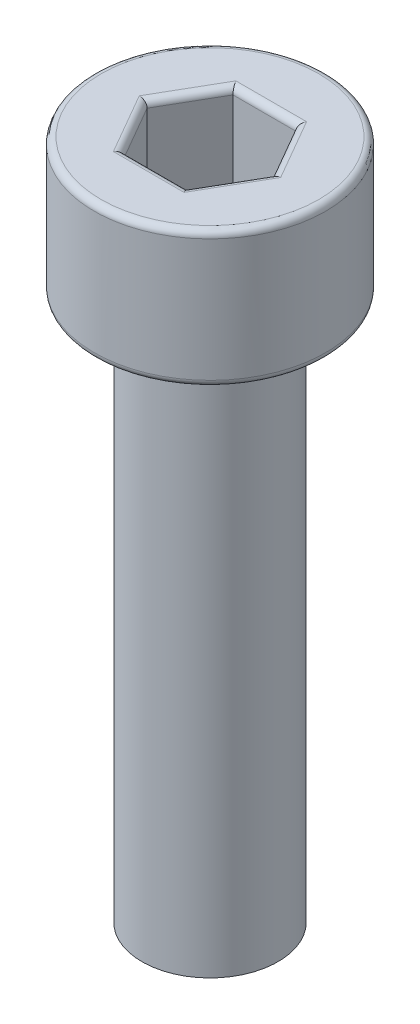
ISO-10303-21;
HEADER;
FILE_DESCRIPTION(('STEP AP214'),'2;1');
FILE_NAME('part.step','',(''),(''),'','','');
FILE_SCHEMA(('AUTOMOTIVE_DESIGN { 1 0 10303 214 1 1 1 1 }'));
ENDSEC;
DATA;
#1=APPLICATION_CONTEXT('core data for automotive mechanical design processes');
#2=APPLICATION_PROTOCOL_DEFINITION('international standard','automotive_design',2000,#1);
#3=PRODUCT_CONTEXT('',#1,'mechanical');
#4=PRODUCT('Part','Part','',(#3));
#5=PRODUCT_RELATED_PRODUCT_CATEGORY('part','',(#4));
#6=PRODUCT_DEFINITION_FORMATION('','',#4);
#7=PRODUCT_DEFINITION_CONTEXT('part definition',#1,'design');
#8=PRODUCT_DEFINITION('design','',#6,#7);
#9=PRODUCT_DEFINITION_SHAPE('','',#8);
#10=(LENGTH_UNIT() NAMED_UNIT(*) SI_UNIT(.MILLI.,.METRE.));
#11=(NAMED_UNIT(*) PLANE_ANGLE_UNIT() SI_UNIT($,.RADIAN.));
#12=(NAMED_UNIT(*) SI_UNIT($,.STERADIAN.) SOLID_ANGLE_UNIT());
#13=UNCERTAINTY_MEASURE_WITH_UNIT(LENGTH_MEASURE(1.E-05),#10,'distance_accuracy_value','');
#14=(GEOMETRIC_REPRESENTATION_CONTEXT(3) GLOBAL_UNCERTAINTY_ASSIGNED_CONTEXT((#13)) GLOBAL_UNIT_ASSIGNED_CONTEXT((#10,
#11,#12)) REPRESENTATION_CONTEXT('',''));
#15=CARTESIAN_POINT('',(0.,0.,0.));
#16=DIRECTION('',(0.,0.,1.));
#17=DIRECTION('',(1.,0.,0.));
#18=AXIS2_PLACEMENT_3D('',#15,#16,#17);
#19=CARTESIAN_POINT('',(2.45056654618361E-11,5.,0.));
#20=DIRECTION('',(0.,-1.,0.));
#21=DIRECTION('',(1.,0.,0.));
#22=AXIS2_PLACEMENT_3D('',#19,#20,#21);
#23=PLANE('',#22);
#24=CARTESIAN_POINT('',(0.,5.,0.));
#25=DIRECTION('',(0.,-1.,0.));
#26=DIRECTION('',(1.,0.,0.));
#27=AXIS2_PLACEMENT_3D('',#24,#25,#26);
#28=CIRCLE('',#27,4.0000000000245);
#29=CARTESIAN_POINT('',(4.0000000000245,5.,0.));
#30=VERTEX_POINT('',#29);
#31=EDGE_CURVE('E179',#30,#30,#28,.F.);
#32=ORIENTED_EDGE('',*,*,#31,.T.);
#33=EDGE_LOOP('',(#32));
#34=FACE_BOUND('',#33,.T.);
#35=DIRECTION('',(-0.5,0.,0.866025403784439));
#36=VECTOR('',#35,1.);
#37=CARTESIAN_POINT('',(-1.94855715850886,5.,-1.12500000001061));
#38=LINE('',#37,#36);
#39=CARTESIAN_POINT('',(-2.59807621135332,5.,0.));
#40=VERTEX_POINT('',#39);
#41=CARTESIAN_POINT('',(-1.29903810567666,5.,-2.25));
#42=VERTEX_POINT('',#41);
#43=EDGE_CURVE('E174',#40,#42,#38,.F.);
#44=ORIENTED_EDGE('',*,*,#43,.T.);
#45=DIRECTION('',(-1.,0.,0.));
#46=VECTOR('',#45,1.);
#47=CARTESIAN_POINT('',(2.45056654618361E-11,5.,-2.25));
#48=LINE('',#47,#46);
#49=CARTESIAN_POINT('',(1.29903810567666,5.,-2.25));
#50=VERTEX_POINT('',#49);
#51=EDGE_CURVE('E176',#42,#50,#48,.F.);
#52=ORIENTED_EDGE('',*,*,#51,.T.);
#53=DIRECTION('',(-0.5,0.,-0.866025403784439));
#54=VECTOR('',#53,1.);
#55=CARTESIAN_POINT('',(1.94855715852111,5.,-1.12499999998939));
#56=LINE('',#55,#54);
#57=CARTESIAN_POINT('',(2.59807621135331,5.,0.));
#58=VERTEX_POINT('',#57);
#59=EDGE_CURVE('E166',#50,#58,#56,.F.);
#60=ORIENTED_EDGE('',*,*,#59,.T.);
#61=DIRECTION('',(0.5,0.,-0.866025403784439));
#62=VECTOR('',#61,1.);
#63=CARTESIAN_POINT('',(1.94855715852111,5.,1.12499999998939));
#64=LINE('',#63,#62);
#65=CARTESIAN_POINT('',(1.29903810567666,5.,2.25));
#66=VERTEX_POINT('',#65);
#67=EDGE_CURVE('E168',#58,#66,#64,.F.);
#68=ORIENTED_EDGE('',*,*,#67,.T.);
#69=DIRECTION('',(1.,0.,0.));
#70=VECTOR('',#69,1.);
#71=CARTESIAN_POINT('',(2.45052429358553E-11,5.,2.25));
#72=LINE('',#71,#70);
#73=CARTESIAN_POINT('',(-1.29903810567666,5.,2.25));
#74=VERTEX_POINT('',#73);
#75=EDGE_CURVE('E170',#66,#74,#72,.F.);
#76=ORIENTED_EDGE('',*,*,#75,.T.);
#77=DIRECTION('',(0.5,0.,0.866025403784439));
#78=VECTOR('',#77,1.);
#79=CARTESIAN_POINT('',(-1.94855715850886,5.,1.12500000001061));
#80=LINE('',#79,#78);
#81=EDGE_CURVE('E172',#74,#40,#80,.F.);
#82=ORIENTED_EDGE('',*,*,#81,.T.);
#83=EDGE_LOOP('',(#44,#52,#60,#68,#76,#82));
#84=FACE_BOUND('',#83,.T.);
#85=ADVANCED_FACE('F33',(#34,#84),#23,.F.);
#86=CARTESIAN_POINT('',(0.,21.3223243250921,0.));
#87=DIRECTION('',(0.,1.,0.));
#88=DIRECTION('',(-1.,0.,0.));
#89=AXIS2_PLACEMENT_3D('',#86,#87,#88);
#90=CYLINDRICAL_SURFACE('',#89,4.2500000000245);
#91=CARTESIAN_POINT('',(0.,0.25,0.));
#92=DIRECTION('',(0.,1.,0.));
#93=DIRECTION('',(-1.,0.,0.));
#94=AXIS2_PLACEMENT_3D('',#91,#92,#93);
#95=CIRCLE('',#94,4.2500000000245);
#96=CARTESIAN_POINT('',(-4.2500000000245,0.25,0.));
#97=VERTEX_POINT('',#96);
#98=EDGE_CURVE('E163',#97,#97,#95,.T.);
#99=ORIENTED_EDGE('',*,*,#98,.T.);
#100=EDGE_LOOP('',(#99));
#101=FACE_BOUND('',#100,.T.);
#102=CARTESIAN_POINT('',(0.,4.75,0.));
#103=DIRECTION('',(0.,-1.,0.));
#104=DIRECTION('',(1.,0.,0.));
#105=AXIS2_PLACEMENT_3D('',#102,#103,#104);
#106=CIRCLE('',#105,4.2500000000245);
#107=CARTESIAN_POINT('',(4.2500000000245,4.75,0.));
#108=VERTEX_POINT('',#107);
#109=EDGE_CURVE('E160',#108,#108,#106,.T.);
#110=ORIENTED_EDGE('',*,*,#109,.T.);
#111=EDGE_LOOP('',(#110));
#112=FACE_BOUND('',#111,.T.);
#113=ADVANCED_FACE('F240',(#101,#112),#90,.T.);
#114=CARTESIAN_POINT('',(4.2500000000245,0.,0.));
#115=DIRECTION('',(0.,1.,0.));
#116=DIRECTION('',(-1.,0.,0.));
#117=AXIS2_PLACEMENT_3D('',#114,#115,#116);
#118=PLANE('',#117);
#119=CARTESIAN_POINT('',(0.,0.,0.));
#120=DIRECTION('',(0.,1.,0.));
#121=DIRECTION('',(-1.,0.,0.));
#122=AXIS2_PLACEMENT_3D('',#119,#120,#121);
#123=CIRCLE('',#122,2.74999999997329);
#124=CARTESIAN_POINT('',(-2.74999999997329,0.,0.));
#125=VERTEX_POINT('',#124);
#126=EDGE_CURVE('E154',#125,#125,#123,.T.);
#127=ORIENTED_EDGE('',*,*,#126,.T.);
#128=EDGE_LOOP('',(#127));
#129=FACE_BOUND('',#128,.T.);
#130=CARTESIAN_POINT('',(0.,0.,0.));
#131=DIRECTION('',(0.,1.,0.));
#132=DIRECTION('',(-1.,0.,0.));
#133=AXIS2_PLACEMENT_3D('',#130,#131,#132);
#134=CIRCLE('',#133,4.0000000000245);
#135=CARTESIAN_POINT('',(-4.0000000000245,0.,0.));
#136=VERTEX_POINT('',#135);
#137=EDGE_CURVE('E151',#136,#136,#134,.F.);
#138=ORIENTED_EDGE('',*,*,#137,.T.);
#139=EDGE_LOOP('',(#138));
#140=FACE_BOUND('',#139,.T.);
#141=ADVANCED_FACE('F246',(#129,#140),#118,.F.);
#142=CARTESIAN_POINT('',(0.,21.3223243250921,0.));
#143=DIRECTION('',(0.,1.,0.));
#144=DIRECTION('',(-1.,0.,0.));
#145=AXIS2_PLACEMENT_3D('',#142,#143,#144);
#146=CYLINDRICAL_SURFACE('',#145,2.49999999997329);
#147=CARTESIAN_POINT('',(0.,-0.25,0.));
#148=DIRECTION('',(0.,1.,0.));
#149=DIRECTION('',(-1.,0.,0.));
#150=AXIS2_PLACEMENT_3D('',#147,#148,#149);
#151=CIRCLE('',#150,2.49999999997329);
#152=CARTESIAN_POINT('',(-2.49999999997329,-0.250000000000001,0.));
#153=VERTEX_POINT('',#152);
#154=EDGE_CURVE('E157',#153,#153,#151,.F.);
#155=ORIENTED_EDGE('',*,*,#154,.T.);
#156=EDGE_LOOP('',(#155));
#157=FACE_BOUND('',#156,.T.);
#158=CARTESIAN_POINT('',(0.,-20.,0.));
#159=DIRECTION('',(0.,1.,0.));
#160=DIRECTION('',(-1.,0.,0.));
#161=AXIS2_PLACEMENT_3D('',#158,#159,#160);
#162=CIRCLE('',#161,2.49999999997329);
#163=CARTESIAN_POINT('',(-2.49999999997329,-20.,0.));
#164=VERTEX_POINT('',#163);
#165=EDGE_CURVE('E139',#164,#164,#162,.T.);
#166=ORIENTED_EDGE('',*,*,#165,.T.);
#167=EDGE_LOOP('',(#166));
#168=FACE_BOUND('',#167,.T.);
#169=ADVANCED_FACE('F338',(#157,#168),#146,.T.);
#170=CARTESIAN_POINT('',(2.4999999999733,-20.,0.));
#171=DIRECTION('',(0.,1.,0.));
#172=DIRECTION('',(-1.,0.,0.));
#173=AXIS2_PLACEMENT_3D('',#170,#171,#172);
#174=PLANE('',#173);
#175=ORIENTED_EDGE('',*,*,#165,.F.);
#176=EDGE_LOOP('',(#175));
#177=FACE_BOUND('',#176,.T.);
#178=ADVANCED_FACE('F236',(#177),#174,.F.);
#179=CARTESIAN_POINT('',(1.15470053837925,1.5,2.));
#180=DIRECTION('',(0.866025403784439,0.,0.5));
#181=DIRECTION('',(0.5,0.,-0.866025403784439));
#182=AXIS2_PLACEMENT_3D('',#179,#180,#181);
#183=PLANE('',#182);
#184=DIRECTION('',(0.,1.,0.));
#185=VECTOR('',#184,1.);
#186=CARTESIAN_POINT('',(1.15470053837925,1.5,2.));
#187=LINE('',#186,#185);
#188=CARTESIAN_POINT('',(1.15470053837925,1.5,2.));
#189=VERTEX_POINT('',#188);
#190=CARTESIAN_POINT('',(1.15470053837925,4.75,2.));
#191=VERTEX_POINT('',#190);
#192=EDGE_CURVE('E137',#189,#191,#187,.T.);
#193=ORIENTED_EDGE('',*,*,#192,.T.);
#194=DIRECTION('',(0.5,0.,-0.866025403784439));
#195=VECTOR('',#194,1.);
#196=CARTESIAN_POINT('',(1.15470053837925,4.75,2.));
#197=LINE('',#196,#195);
#198=CARTESIAN_POINT('',(2.3094010767585,4.75,0.));
#199=VERTEX_POINT('',#198);
#200=EDGE_CURVE('E42',#191,#199,#197,.T.);
#201=ORIENTED_EDGE('',*,*,#200,.T.);
#202=DIRECTION('',(0.,1.,0.));
#203=VECTOR('',#202,1.);
#204=CARTESIAN_POINT('',(2.3094010767585,1.5,0.));
#205=LINE('',#204,#203);
#206=CARTESIAN_POINT('',(2.3094010767585,1.5,0.));
#207=VERTEX_POINT('',#206);
#208=EDGE_CURVE('E103',#207,#199,#205,.T.);
#209=ORIENTED_EDGE('',*,*,#208,.F.);
#210=DIRECTION('',(0.5,0.,-0.866025403784439));
#211=VECTOR('',#210,1.);
#212=CARTESIAN_POINT('',(1.15470053837925,1.5,2.));
#213=LINE('',#212,#211);
#214=EDGE_CURVE('E107',#189,#207,#213,.T.);
#215=ORIENTED_EDGE('',*,*,#214,.F.);
#216=EDGE_LOOP('',(#193,#201,#209,#215));
#217=FACE_BOUND('',#216,.T.);
#218=ADVANCED_FACE('F105',(#217),#183,.F.);
#219=CARTESIAN_POINT('',(-1.15470053837925,1.5,2.));
#220=DIRECTION('',(0.,0.,1.));
#221=DIRECTION('',(1.,0.,0.));
#222=AXIS2_PLACEMENT_3D('',#219,#220,#221);
#223=PLANE('',#222);
#224=DIRECTION('',(0.,1.,0.));
#225=VECTOR('',#224,1.);
#226=CARTESIAN_POINT('',(-1.15470053837925,1.5,2.));
#227=LINE('',#226,#225);
#228=CARTESIAN_POINT('',(-1.15470053837925,1.5,2.));
#229=VERTEX_POINT('',#228);
#230=CARTESIAN_POINT('',(-1.15470053837925,4.75,2.));
#231=VERTEX_POINT('',#230);
#232=EDGE_CURVE('E140',#229,#231,#227,.T.);
#233=ORIENTED_EDGE('',*,*,#232,.T.);
#234=DIRECTION('',(1.,0.,0.));
#235=VECTOR('',#234,1.);
#236=CARTESIAN_POINT('',(-1.15470053837925,4.75,2.));
#237=LINE('',#236,#235);
#238=EDGE_CURVE('E57',#231,#191,#237,.T.);
#239=ORIENTED_EDGE('',*,*,#238,.T.);
#240=ORIENTED_EDGE('',*,*,#192,.F.);
#241=DIRECTION('',(1.,0.,0.));
#242=VECTOR('',#241,1.);
#243=CARTESIAN_POINT('',(-1.15470053837925,1.5,2.));
#244=LINE('',#243,#242);
#245=EDGE_CURVE('E112',#229,#189,#244,.T.);
#246=ORIENTED_EDGE('',*,*,#245,.F.);
#247=EDGE_LOOP('',(#233,#239,#240,#246));
#248=FACE_BOUND('',#247,.T.);
#249=ADVANCED_FACE('F228',(#248),#223,.F.);
#250=CARTESIAN_POINT('',(-2.30940107675851,1.5,0.));
#251=DIRECTION('',(-0.866025403784438,0.,0.5));
#252=DIRECTION('',(0.5,0.,0.866025403784439));
#253=AXIS2_PLACEMENT_3D('',#250,#251,#252);
#254=PLANE('',#253);
#255=DIRECTION('',(0.,1.,0.));
#256=VECTOR('',#255,1.);
#257=CARTESIAN_POINT('',(-2.30940107675851,1.5,0.));
#258=LINE('',#257,#256);
#259=CARTESIAN_POINT('',(-2.30940107675851,1.5,0.));
#260=VERTEX_POINT('',#259);
#261=CARTESIAN_POINT('',(-2.30940107675851,4.75,0.));
#262=VERTEX_POINT('',#261);
#263=EDGE_CURVE('E142',#260,#262,#258,.T.);
#264=ORIENTED_EDGE('',*,*,#263,.T.);
#265=DIRECTION('',(0.5,0.,0.866025403784439));
#266=VECTOR('',#265,1.);
#267=CARTESIAN_POINT('',(-2.30940107675851,4.75,0.));
#268=LINE('',#267,#266);
#269=EDGE_CURVE('E187',#262,#231,#268,.T.);
#270=ORIENTED_EDGE('',*,*,#269,.T.);
#271=ORIENTED_EDGE('',*,*,#232,.F.);
#272=DIRECTION('',(0.5,0.,0.866025403784438));
#273=VECTOR('',#272,1.);
#274=CARTESIAN_POINT('',(-2.30940107675851,1.5,0.));
#275=LINE('',#274,#273);
#276=EDGE_CURVE('E134',#260,#229,#275,.T.);
#277=ORIENTED_EDGE('',*,*,#276,.F.);
#278=EDGE_LOOP('',(#264,#270,#271,#277));
#279=FACE_BOUND('',#278,.T.);
#280=ADVANCED_FACE('F227',(#279),#254,.F.);
#281=CARTESIAN_POINT('',(-1.15470053837925,1.5,-2.));
#282=DIRECTION('',(-0.866025403784438,0.,-0.5));
#283=DIRECTION('',(-0.5,0.,0.866025403784439));
#284=AXIS2_PLACEMENT_3D('',#281,#282,#283);
#285=PLANE('',#284);
#286=DIRECTION('',(0.,1.,0.));
#287=VECTOR('',#286,1.);
#288=CARTESIAN_POINT('',(-1.15470053837925,1.5,-2.));
#289=LINE('',#288,#287);
#290=CARTESIAN_POINT('',(-1.15470053837925,1.5,-2.));
#291=VERTEX_POINT('',#290);
#292=CARTESIAN_POINT('',(-1.15470053837925,4.75,-2.));
#293=VERTEX_POINT('',#292);
#294=EDGE_CURVE('E145',#291,#293,#289,.T.);
#295=ORIENTED_EDGE('',*,*,#294,.T.);
#296=DIRECTION('',(-0.5,0.,0.866025403784439));
#297=VECTOR('',#296,1.);
#298=CARTESIAN_POINT('',(-1.15470053837925,4.75,-2.));
#299=LINE('',#298,#297);
#300=EDGE_CURVE('E185',#293,#262,#299,.T.);
#301=ORIENTED_EDGE('',*,*,#300,.T.);
#302=ORIENTED_EDGE('',*,*,#263,.F.);
#303=DIRECTION('',(-0.5,0.,0.866025403784439));
#304=VECTOR('',#303,1.);
#305=CARTESIAN_POINT('',(-1.15470053837925,1.5,-2.));
#306=LINE('',#305,#304);
#307=EDGE_CURVE('E131',#291,#260,#306,.T.);
#308=ORIENTED_EDGE('',*,*,#307,.F.);
#309=EDGE_LOOP('',(#295,#301,#302,#308));
#310=FACE_BOUND('',#309,.T.);
#311=ADVANCED_FACE('F224',(#310),#285,.F.);
#312=CARTESIAN_POINT('',(1.15470053837925,1.5,-2.));
#313=DIRECTION('',(0.,0.,-1.));
#314=DIRECTION('',(-1.,0.,0.));
#315=AXIS2_PLACEMENT_3D('',#312,#313,#314);
#316=PLANE('',#315);
#317=DIRECTION('',(0.,1.,0.));
#318=VECTOR('',#317,1.);
#319=CARTESIAN_POINT('',(1.15470053837925,1.5,-2.));
#320=LINE('',#319,#318);
#321=CARTESIAN_POINT('',(1.15470053837925,1.5,-2.));
#322=VERTEX_POINT('',#321);
#323=CARTESIAN_POINT('',(1.15470053837925,4.75,-2.));
#324=VERTEX_POINT('',#323);
#325=EDGE_CURVE('E111',#322,#324,#320,.T.);
#326=ORIENTED_EDGE('',*,*,#325,.T.);
#327=DIRECTION('',(-1.,0.,0.));
#328=VECTOR('',#327,1.);
#329=CARTESIAN_POINT('',(1.15470053837925,4.75,-2.));
#330=LINE('',#329,#328);
#331=EDGE_CURVE('E182',#324,#293,#330,.T.);
#332=ORIENTED_EDGE('',*,*,#331,.T.);
#333=ORIENTED_EDGE('',*,*,#294,.F.);
#334=DIRECTION('',(-1.,0.,0.));
#335=VECTOR('',#334,1.);
#336=CARTESIAN_POINT('',(1.15470053837925,1.5,-2.));
#337=LINE('',#336,#335);
#338=EDGE_CURVE('E121',#322,#291,#337,.T.);
#339=ORIENTED_EDGE('',*,*,#338,.F.);
#340=EDGE_LOOP('',(#326,#332,#333,#339));
#341=FACE_BOUND('',#340,.T.);
#342=ADVANCED_FACE('F220',(#341),#316,.F.);
#343=CARTESIAN_POINT('',(2.3094010767585,1.5,0.));
#344=DIRECTION('',(0.866025403784438,0.,-0.5));
#345=DIRECTION('',(-0.5,0.,-0.866025403784439));
#346=AXIS2_PLACEMENT_3D('',#343,#344,#345);
#347=PLANE('',#346);
#348=ORIENTED_EDGE('',*,*,#208,.T.);
#349=DIRECTION('',(-0.5,0.,-0.866025403784439));
#350=VECTOR('',#349,1.);
#351=CARTESIAN_POINT('',(2.3094010767585,4.75,0.));
#352=LINE('',#351,#350);
#353=EDGE_CURVE('E11',#199,#324,#352,.T.);
#354=ORIENTED_EDGE('',*,*,#353,.T.);
#355=ORIENTED_EDGE('',*,*,#325,.F.);
#356=DIRECTION('',(-0.5,0.,-0.866025403784438));
#357=VECTOR('',#356,1.);
#358=CARTESIAN_POINT('',(2.3094010767585,1.5,0.));
#359=LINE('',#358,#357);
#360=EDGE_CURVE('E115',#207,#322,#359,.T.);
#361=ORIENTED_EDGE('',*,*,#360,.F.);
#362=EDGE_LOOP('',(#348,#354,#355,#361));
#363=FACE_BOUND('',#362,.T.);
#364=ADVANCED_FACE('F116',(#363),#347,.F.);
#365=CARTESIAN_POINT('',(0.,1.5,0.));
#366=DIRECTION('',(0.,1.,0.));
#367=DIRECTION('',(0.,0.,1.));
#368=AXIS2_PLACEMENT_3D('',#365,#366,#367);
#369=PLANE('',#368);
#370=ORIENTED_EDGE('',*,*,#214,.T.);
#371=ORIENTED_EDGE('',*,*,#360,.T.);
#372=ORIENTED_EDGE('',*,*,#338,.T.);
#373=ORIENTED_EDGE('',*,*,#307,.T.);
#374=ORIENTED_EDGE('',*,*,#276,.T.);
#375=ORIENTED_EDGE('',*,*,#245,.T.);
#376=EDGE_LOOP('',(#370,#371,#372,#373,#374,#375));
#377=FACE_BOUND('',#376,.T.);
#378=ADVANCED_FACE('F123',(#377),#369,.T.);
#379=CARTESIAN_POINT('',(0.,-0.25,0.));
#380=DIRECTION('',(0.,1.,0.));
#381=DIRECTION('',(-1.,0.,0.));
#382=AXIS2_PLACEMENT_3D('',#379,#380,#381);
#383=TOROIDAL_SURFACE('',#382,2.74999999997329,0.25);
#384=ORIENTED_EDGE('',*,*,#154,.F.);
#385=EDGE_LOOP('',(#384));
#386=FACE_BOUND('',#385,.T.);
#387=ORIENTED_EDGE('',*,*,#126,.F.);
#388=EDGE_LOOP('',(#387));
#389=FACE_BOUND('',#388,.T.);
#390=ADVANCED_FACE('F252',(#386,#389),#383,.F.);
#391=CARTESIAN_POINT('',(0.,0.25,0.));
#392=DIRECTION('',(0.,1.,0.));
#393=DIRECTION('',(-1.,0.,0.));
#394=AXIS2_PLACEMENT_3D('',#391,#392,#393);
#395=TOROIDAL_SURFACE('',#394,4.0000000000245,0.25);
#396=ORIENTED_EDGE('',*,*,#137,.F.);
#397=EDGE_LOOP('',(#396));
#398=FACE_BOUND('',#397,.T.);
#399=ORIENTED_EDGE('',*,*,#98,.F.);
#400=EDGE_LOOP('',(#399));
#401=FACE_BOUND('',#400,.T.);
#402=ADVANCED_FACE('F255',(#398,#401),#395,.T.);
#403=CARTESIAN_POINT('',(0.,4.75,0.));
#404=DIRECTION('',(0.,-1.,0.));
#405=DIRECTION('',(1.,0.,0.));
#406=AXIS2_PLACEMENT_3D('',#403,#404,#405);
#407=TOROIDAL_SURFACE('',#406,4.0000000000245,0.25);
#408=ORIENTED_EDGE('',*,*,#109,.F.);
#409=EDGE_LOOP('',(#408));
#410=FACE_BOUND('',#409,.T.);
#411=ORIENTED_EDGE('',*,*,#31,.F.);
#412=EDGE_LOOP('',(#411));
#413=FACE_BOUND('',#412,.T.);
#414=ADVANCED_FACE('F259',(#410,#413),#407,.T.);
#415=CARTESIAN_POINT('',(-1.15470053837925,4.75,2.25));
#416=DIRECTION('',(1.,0.,0.));
#417=DIRECTION('',(0.,0.,-1.));
#418=AXIS2_PLACEMENT_3D('',#415,#416,#417);
#419=CYLINDRICAL_SURFACE('',#418,0.25);
#420=CARTESIAN_POINT('',(-1.29903810567666,4.75,2.25));
#421=DIRECTION('',(0.866025403784439,0.,0.5));
#422=DIRECTION('',(-0.5,0.,0.866025403784439));
#423=AXIS2_PLACEMENT_3D('',#420,#421,#422);
#424=ELLIPSE('',#423,0.288675134594813,0.25);
#425=EDGE_CURVE('E128',#74,#231,#424,.F.);
#426=ORIENTED_EDGE('',*,*,#425,.F.);
#427=ORIENTED_EDGE('',*,*,#75,.F.);
#428=CARTESIAN_POINT('',(1.29903810567666,4.75,2.25));
#429=DIRECTION('',(0.866025403784438,0.,-0.5));
#430=DIRECTION('',(0.5,0.,0.866025403784439));
#431=AXIS2_PLACEMENT_3D('',#428,#429,#430);
#432=ELLIPSE('',#431,0.288675134594813,0.25);
#433=EDGE_CURVE('E37',#191,#66,#432,.T.);
#434=ORIENTED_EDGE('',*,*,#433,.F.);
#435=ORIENTED_EDGE('',*,*,#238,.F.);
#436=EDGE_LOOP('',(#426,#427,#434,#435));
#437=FACE_BOUND('',#436,.T.);
#438=ADVANCED_FACE('F35',(#437),#419,.T.);
#439=CARTESIAN_POINT('',(1.37120688932536,4.75,2.125));
#440=DIRECTION('',(0.5,0.,-0.866025403784439));
#441=DIRECTION('',(-0.866025403784439,0.,-0.5));
#442=AXIS2_PLACEMENT_3D('',#439,#440,#441);
#443=CYLINDRICAL_SURFACE('',#442,0.25);
#444=ORIENTED_EDGE('',*,*,#433,.T.);
#445=ORIENTED_EDGE('',*,*,#67,.F.);
#446=CARTESIAN_POINT('',(2.59807621135331,4.75,0.));
#447=DIRECTION('',(0.,0.,-1.));
#448=DIRECTION('',(1.,0.,0.));
#449=AXIS2_PLACEMENT_3D('',#446,#447,#448);
#450=ELLIPSE('',#449,0.288675134594813,0.25);
#451=EDGE_CURVE('E198',#199,#58,#450,.T.);
#452=ORIENTED_EDGE('',*,*,#451,.F.);
#453=ORIENTED_EDGE('',*,*,#200,.F.);
#454=EDGE_LOOP('',(#444,#445,#452,#453));
#455=FACE_BOUND('',#454,.T.);
#456=ADVANCED_FACE('F212',(#455),#443,.T.);
#457=CARTESIAN_POINT('',(-2.52590742770462,4.75,0.125));
#458=DIRECTION('',(0.5,0.,0.866025403784439));
#459=DIRECTION('',(0.866025403784438,0.,-0.5));
#460=AXIS2_PLACEMENT_3D('',#457,#458,#459);
#461=CYLINDRICAL_SURFACE('',#460,0.25);
#462=ORIENTED_EDGE('',*,*,#425,.T.);
#463=ORIENTED_EDGE('',*,*,#269,.F.);
#464=CARTESIAN_POINT('',(-2.59807621135332,4.75,0.));
#465=DIRECTION('',(0.,0.,1.));
#466=DIRECTION('',(-1.,0.,0.));
#467=AXIS2_PLACEMENT_3D('',#464,#465,#466);
#468=ELLIPSE('',#467,0.288675134594813,0.25);
#469=EDGE_CURVE('E195',#40,#262,#468,.F.);
#470=ORIENTED_EDGE('',*,*,#469,.F.);
#471=ORIENTED_EDGE('',*,*,#81,.F.);
#472=EDGE_LOOP('',(#462,#463,#470,#471));
#473=FACE_BOUND('',#472,.T.);
#474=ADVANCED_FACE('F205',(#473),#461,.T.);
#475=CARTESIAN_POINT('',(2.52590742770461,4.75,-0.125000000000001));
#476=DIRECTION('',(-0.5,0.,-0.866025403784439));
#477=DIRECTION('',(-0.866025403784438,0.,0.5));
#478=AXIS2_PLACEMENT_3D('',#475,#476,#477);
#479=CYLINDRICAL_SURFACE('',#478,0.25);
#480=ORIENTED_EDGE('',*,*,#451,.T.);
#481=ORIENTED_EDGE('',*,*,#59,.F.);
#482=CARTESIAN_POINT('',(1.29903810567666,4.75,-2.25));
#483=DIRECTION('',(-0.866025403784439,0.,-0.5));
#484=DIRECTION('',(-0.5,0.,0.866025403784439));
#485=AXIS2_PLACEMENT_3D('',#482,#483,#484);
#486=ELLIPSE('',#485,0.288675134594813,0.25);
#487=EDGE_CURVE('E193',#324,#50,#486,.T.);
#488=ORIENTED_EDGE('',*,*,#487,.F.);
#489=ORIENTED_EDGE('',*,*,#353,.F.);
#490=EDGE_LOOP('',(#480,#481,#488,#489));
#491=FACE_BOUND('',#490,.T.);
#492=ADVANCED_FACE('F217',(#491),#479,.T.);
#493=CARTESIAN_POINT('',(-1.37120688932536,4.75,-2.125));
#494=DIRECTION('',(-0.5,0.,0.866025403784439));
#495=DIRECTION('',(0.866025403784438,0.,0.5));
#496=AXIS2_PLACEMENT_3D('',#493,#494,#495);
#497=CYLINDRICAL_SURFACE('',#496,0.25);
#498=ORIENTED_EDGE('',*,*,#469,.T.);
#499=ORIENTED_EDGE('',*,*,#300,.F.);
#500=CARTESIAN_POINT('',(-1.29903810567666,4.75,-2.25));
#501=DIRECTION('',(-0.866025403784439,0.,0.5));
#502=DIRECTION('',(-0.5,0.,-0.866025403784439));
#503=AXIS2_PLACEMENT_3D('',#500,#501,#502);
#504=ELLIPSE('',#503,0.288675134594813,0.25);
#505=EDGE_CURVE('E191',#42,#293,#504,.F.);
#506=ORIENTED_EDGE('',*,*,#505,.F.);
#507=ORIENTED_EDGE('',*,*,#43,.F.);
#508=EDGE_LOOP('',(#498,#499,#506,#507));
#509=FACE_BOUND('',#508,.T.);
#510=ADVANCED_FACE('F267',(#509),#497,.T.);
#511=CARTESIAN_POINT('',(1.15470053837925,4.75,-2.25));
#512=DIRECTION('',(-1.,0.,0.));
#513=DIRECTION('',(0.,-1.,0.));
#514=AXIS2_PLACEMENT_3D('',#511,#512,#513);
#515=CYLINDRICAL_SURFACE('',#514,0.25);
#516=ORIENTED_EDGE('',*,*,#487,.T.);
#517=ORIENTED_EDGE('',*,*,#51,.F.);
#518=ORIENTED_EDGE('',*,*,#505,.T.);
#519=ORIENTED_EDGE('',*,*,#331,.F.);
#520=EDGE_LOOP('',(#516,#517,#518,#519));
#521=FACE_BOUND('',#520,.T.);
#522=ADVANCED_FACE('F264',(#521),#515,.T.);
#523=CLOSED_SHELL('',(#85,#113,#141,#169,#178,#218,#249,#280,#311,#342,#364,#378,#390,#402,#414,
#438,#456,#474,#492,#510,#522));
#524=MANIFOLD_SOLID_BREP('B2',#523);
#525=ADVANCED_BREP_SHAPE_REPRESENTATION('',(#18,#524),#14);
#526=SHAPE_DEFINITION_REPRESENTATION(#9,#525);
ENDSEC;
END-ISO-10303-21;
